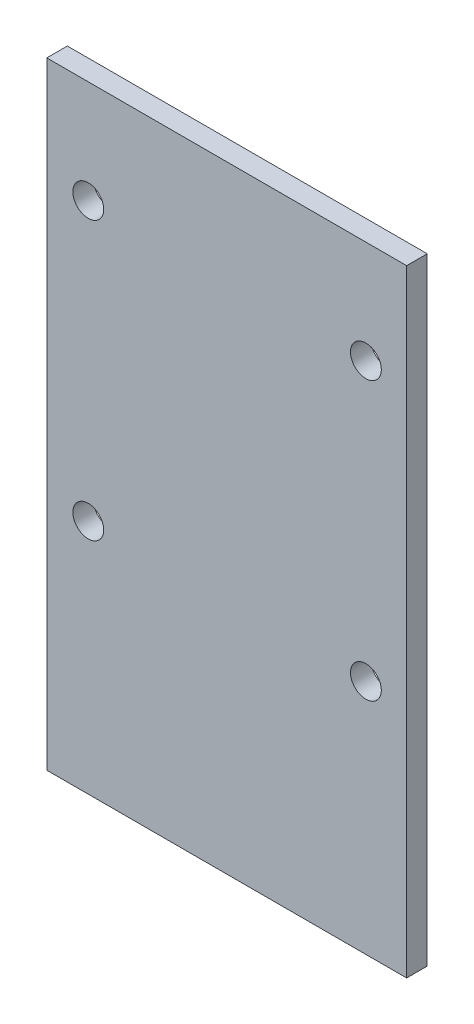
ISO-10303-21;
HEADER;
FILE_DESCRIPTION(('STEP AP214'),'2;1');
FILE_NAME('part.step','',(''),(''),'','','');
FILE_SCHEMA(('AUTOMOTIVE_DESIGN { 1 0 10303 214 1 1 1 1 }'));
ENDSEC;
DATA;
#1=APPLICATION_CONTEXT('core data for automotive mechanical design processes');
#2=APPLICATION_PROTOCOL_DEFINITION('international standard','automotive_design',2000,#1);
#3=PRODUCT_CONTEXT('',#1,'mechanical');
#4=PRODUCT('Part','Part','',(#3));
#5=PRODUCT_RELATED_PRODUCT_CATEGORY('part','',(#4));
#6=PRODUCT_DEFINITION_FORMATION('','',#4);
#7=PRODUCT_DEFINITION_CONTEXT('part definition',#1,'design');
#8=PRODUCT_DEFINITION('design','',#6,#7);
#9=PRODUCT_DEFINITION_SHAPE('','',#8);
#10=(LENGTH_UNIT() NAMED_UNIT(*) SI_UNIT(.MILLI.,.METRE.));
#11=(NAMED_UNIT(*) PLANE_ANGLE_UNIT() SI_UNIT($,.RADIAN.));
#12=(NAMED_UNIT(*) SI_UNIT($,.STERADIAN.) SOLID_ANGLE_UNIT());
#13=UNCERTAINTY_MEASURE_WITH_UNIT(LENGTH_MEASURE(1.E-05),#10,'distance_accuracy_value','');
#14=(GEOMETRIC_REPRESENTATION_CONTEXT(3) GLOBAL_UNCERTAINTY_ASSIGNED_CONTEXT((#13)) GLOBAL_UNIT_ASSIGNED_CONTEXT((#10,
#11,#12)) REPRESENTATION_CONTEXT('',''));
#15=CARTESIAN_POINT('',(0.,0.,0.));
#16=DIRECTION('',(0.,0.,1.));
#17=DIRECTION('',(1.,0.,0.));
#18=AXIS2_PLACEMENT_3D('',#15,#16,#17);
#19=CARTESIAN_POINT('',(-17.5,-30.,2.));
#20=DIRECTION('',(1.,0.,0.));
#21=DIRECTION('',(0.,0.,-1.));
#22=AXIS2_PLACEMENT_3D('',#19,#20,#21);
#23=PLANE('',#22);
#24=DIRECTION('',(0.,-1.,0.));
#25=VECTOR('',#24,1.);
#26=CARTESIAN_POINT('',(-17.5,-30.,0.));
#27=LINE('',#26,#25);
#28=CARTESIAN_POINT('',(-17.5,30.,0.));
#29=VERTEX_POINT('',#28);
#30=CARTESIAN_POINT('',(-17.5,-30.,0.));
#31=VERTEX_POINT('',#30);
#32=EDGE_CURVE('E107',#29,#31,#27,.T.);
#33=ORIENTED_EDGE('',*,*,#32,.T.);
#34=DIRECTION('',(0.,0.,-1.));
#35=VECTOR('',#34,1.);
#36=CARTESIAN_POINT('',(-17.5,-30.,2.));
#37=LINE('',#36,#35);
#38=CARTESIAN_POINT('',(-17.5,-30.,2.));
#39=VERTEX_POINT('',#38);
#40=EDGE_CURVE('E11',#39,#31,#37,.T.);
#41=ORIENTED_EDGE('',*,*,#40,.F.);
#42=DIRECTION('',(0.,-1.,0.));
#43=VECTOR('',#42,1.);
#44=CARTESIAN_POINT('',(-17.5,-30.,2.));
#45=LINE('',#44,#43);
#46=CARTESIAN_POINT('',(-17.5,30.,2.));
#47=VERTEX_POINT('',#46);
#48=EDGE_CURVE('E91',#47,#39,#45,.T.);
#49=ORIENTED_EDGE('',*,*,#48,.F.);
#50=DIRECTION('',(0.,0.,-1.));
#51=VECTOR('',#50,1.);
#52=CARTESIAN_POINT('',(-17.5,30.,2.));
#53=LINE('',#52,#51);
#54=EDGE_CURVE('E103',#47,#29,#53,.T.);
#55=ORIENTED_EDGE('',*,*,#54,.T.);
#56=EDGE_LOOP('',(#33,#41,#49,#55));
#57=FACE_BOUND('',#56,.T.);
#58=ADVANCED_FACE('F39',(#57),#23,.F.);
#59=CARTESIAN_POINT('',(17.5,-30.,2.));
#60=DIRECTION('',(0.,1.,0.));
#61=DIRECTION('',(-1.,0.,0.));
#62=AXIS2_PLACEMENT_3D('',#59,#60,#61);
#63=PLANE('',#62);
#64=DIRECTION('',(1.,0.,0.));
#65=VECTOR('',#64,1.);
#66=CARTESIAN_POINT('',(17.5,-30.,0.));
#67=LINE('',#66,#65);
#68=CARTESIAN_POINT('',(17.5,-30.,0.));
#69=VERTEX_POINT('',#68);
#70=EDGE_CURVE('E96',#31,#69,#67,.T.);
#71=ORIENTED_EDGE('',*,*,#70,.T.);
#72=DIRECTION('',(0.,0.,-1.));
#73=VECTOR('',#72,1.);
#74=CARTESIAN_POINT('',(17.5,-30.,2.));
#75=LINE('',#74,#73);
#76=CARTESIAN_POINT('',(17.5,-30.,2.));
#77=VERTEX_POINT('',#76);
#78=EDGE_CURVE('E48',#77,#69,#75,.T.);
#79=ORIENTED_EDGE('',*,*,#78,.F.);
#80=DIRECTION('',(1.,0.,0.));
#81=VECTOR('',#80,1.);
#82=CARTESIAN_POINT('',(17.5,-30.,2.));
#83=LINE('',#82,#81);
#84=EDGE_CURVE('E86',#39,#77,#83,.T.);
#85=ORIENTED_EDGE('',*,*,#84,.F.);
#86=ORIENTED_EDGE('',*,*,#40,.T.);
#87=EDGE_LOOP('',(#71,#79,#85,#86));
#88=FACE_BOUND('',#87,.T.);
#89=ADVANCED_FACE('F95',(#88),#63,.F.);
#90=CARTESIAN_POINT('',(17.5,-30.,2.));
#91=DIRECTION('',(-1.,0.,0.));
#92=DIRECTION('',(0.,0.,1.));
#93=AXIS2_PLACEMENT_3D('',#90,#91,#92);
#94=PLANE('',#93);
#95=DIRECTION('',(0.,1.,0.));
#96=VECTOR('',#95,1.);
#97=CARTESIAN_POINT('',(17.5,-30.,0.));
#98=LINE('',#97,#96);
#99=CARTESIAN_POINT('',(17.5,30.,0.));
#100=VERTEX_POINT('',#99);
#101=EDGE_CURVE('E73',#69,#100,#98,.T.);
#102=ORIENTED_EDGE('',*,*,#101,.T.);
#103=DIRECTION('',(0.,0.,-1.));
#104=VECTOR('',#103,1.);
#105=CARTESIAN_POINT('',(17.5,30.,2.));
#106=LINE('',#105,#104);
#107=CARTESIAN_POINT('',(17.5,30.,2.));
#108=VERTEX_POINT('',#107);
#109=EDGE_CURVE('E98',#108,#100,#106,.T.);
#110=ORIENTED_EDGE('',*,*,#109,.F.);
#111=DIRECTION('',(0.,1.,0.));
#112=VECTOR('',#111,1.);
#113=CARTESIAN_POINT('',(17.5,-30.,2.));
#114=LINE('',#113,#112);
#115=EDGE_CURVE('E89',#77,#108,#114,.T.);
#116=ORIENTED_EDGE('',*,*,#115,.F.);
#117=ORIENTED_EDGE('',*,*,#78,.T.);
#118=EDGE_LOOP('',(#102,#110,#116,#117));
#119=FACE_BOUND('',#118,.T.);
#120=ADVANCED_FACE('F99',(#119),#94,.F.);
#121=CARTESIAN_POINT('',(17.5,30.,2.));
#122=DIRECTION('',(0.,-1.,0.));
#123=DIRECTION('',(1.,0.,0.));
#124=AXIS2_PLACEMENT_3D('',#121,#122,#123);
#125=PLANE('',#124);
#126=DIRECTION('',(-1.,0.,0.));
#127=VECTOR('',#126,1.);
#128=CARTESIAN_POINT('',(17.5,30.,0.));
#129=LINE('',#128,#127);
#130=EDGE_CURVE('E79',#100,#29,#129,.T.);
#131=ORIENTED_EDGE('',*,*,#130,.T.);
#132=ORIENTED_EDGE('',*,*,#54,.F.);
#133=DIRECTION('',(-1.,0.,0.));
#134=VECTOR('',#133,1.);
#135=CARTESIAN_POINT('',(17.5,30.,2.));
#136=LINE('',#135,#134);
#137=EDGE_CURVE('E56',#108,#47,#136,.T.);
#138=ORIENTED_EDGE('',*,*,#137,.F.);
#139=ORIENTED_EDGE('',*,*,#109,.T.);
#140=EDGE_LOOP('',(#131,#132,#138,#139));
#141=FACE_BOUND('',#140,.T.);
#142=ADVANCED_FACE('F121',(#141),#125,.F.);
#143=CARTESIAN_POINT('',(0.,0.,2.));
#144=DIRECTION('',(0.,0.,1.));
#145=DIRECTION('',(1.,0.,0.));
#146=AXIS2_PLACEMENT_3D('',#143,#144,#145);
#147=PLANE('',#146);
#148=CARTESIAN_POINT('',(13.5357047155097,20.,2.));
#149=DIRECTION('',(0.,0.,1.));
#150=DIRECTION('',(1.,0.,0.));
#151=AXIS2_PLACEMENT_3D('',#148,#149,#150);
#152=CIRCLE('',#151,1.5);
#153=CARTESIAN_POINT('',(15.0357047155097,20.,2.));
#154=VERTEX_POINT('',#153);
#155=EDGE_CURVE('E145',#154,#154,#152,.T.);
#156=ORIENTED_EDGE('',*,*,#155,.F.);
#157=EDGE_LOOP('',(#156));
#158=FACE_BOUND('',#157,.T.);
#159=CARTESIAN_POINT('',(-13.4642952844903,-6.99999999999999,2.));
#160=DIRECTION('',(0.,0.,1.));
#161=DIRECTION('',(1.,0.,0.));
#162=AXIS2_PLACEMENT_3D('',#159,#160,#161);
#163=CIRCLE('',#162,1.5);
#164=CARTESIAN_POINT('',(-11.9642952844903,-6.99999999999999,2.));
#165=VERTEX_POINT('',#164);
#166=EDGE_CURVE('E136',#165,#165,#163,.T.);
#167=ORIENTED_EDGE('',*,*,#166,.F.);
#168=EDGE_LOOP('',(#167));
#169=FACE_BOUND('',#168,.T.);
#170=CARTESIAN_POINT('',(13.5357047155097,-6.99999999999998,2.));
#171=DIRECTION('',(0.,0.,1.));
#172=DIRECTION('',(1.,0.,0.));
#173=AXIS2_PLACEMENT_3D('',#170,#171,#172);
#174=CIRCLE('',#173,1.5);
#175=CARTESIAN_POINT('',(15.0357047155097,-6.99999999999998,2.));
#176=VERTEX_POINT('',#175);
#177=EDGE_CURVE('E152',#176,#176,#174,.T.);
#178=ORIENTED_EDGE('',*,*,#177,.F.);
#179=EDGE_LOOP('',(#178));
#180=FACE_BOUND('',#179,.T.);
#181=CARTESIAN_POINT('',(-13.4642952844903,20.,2.));
#182=DIRECTION('',(0.,0.,1.));
#183=DIRECTION('',(1.,0.,0.));
#184=AXIS2_PLACEMENT_3D('',#181,#182,#183);
#185=CIRCLE('',#184,1.5);
#186=CARTESIAN_POINT('',(-11.9642952844903,20.,2.));
#187=VERTEX_POINT('',#186);
#188=EDGE_CURVE('E128',#187,#187,#185,.T.);
#189=ORIENTED_EDGE('',*,*,#188,.F.);
#190=EDGE_LOOP('',(#189));
#191=FACE_BOUND('',#190,.T.);
#192=ORIENTED_EDGE('',*,*,#48,.T.);
#193=ORIENTED_EDGE('',*,*,#84,.T.);
#194=ORIENTED_EDGE('',*,*,#115,.T.);
#195=ORIENTED_EDGE('',*,*,#137,.T.);
#196=EDGE_LOOP('',(#192,#193,#194,#195));
#197=FACE_BOUND('',#196,.T.);
#198=ADVANCED_FACE('F87',(#158,#169,#180,#191,#197),#147,.T.);
#199=CARTESIAN_POINT('',(0.,0.,0.));
#200=DIRECTION('',(0.,0.,1.));
#201=DIRECTION('',(1.,0.,0.));
#202=AXIS2_PLACEMENT_3D('',#199,#200,#201);
#203=PLANE('',#202);
#204=CARTESIAN_POINT('',(13.5357047155097,20.,0.));
#205=DIRECTION('',(0.,0.,1.));
#206=DIRECTION('',(1.,0.,0.));
#207=AXIS2_PLACEMENT_3D('',#204,#205,#206);
#208=CIRCLE('',#207,1.5);
#209=CARTESIAN_POINT('',(15.0357047155097,20.,0.));
#210=VERTEX_POINT('',#209);
#211=EDGE_CURVE('E132',#210,#210,#208,.T.);
#212=ORIENTED_EDGE('',*,*,#211,.T.);
#213=EDGE_LOOP('',(#212));
#214=FACE_BOUND('',#213,.T.);
#215=CARTESIAN_POINT('',(-13.4642952844903,-6.99999999999999,0.));
#216=DIRECTION('',(0.,0.,1.));
#217=DIRECTION('',(1.,0.,0.));
#218=AXIS2_PLACEMENT_3D('',#215,#216,#217);
#219=CIRCLE('',#218,1.5);
#220=CARTESIAN_POINT('',(-11.9642952844903,-6.99999999999999,0.));
#221=VERTEX_POINT('',#220);
#222=EDGE_CURVE('E140',#221,#221,#219,.T.);
#223=ORIENTED_EDGE('',*,*,#222,.T.);
#224=EDGE_LOOP('',(#223));
#225=FACE_BOUND('',#224,.T.);
#226=CARTESIAN_POINT('',(13.5357047155097,-6.99999999999998,0.));
#227=DIRECTION('',(0.,0.,1.));
#228=DIRECTION('',(1.,0.,0.));
#229=AXIS2_PLACEMENT_3D('',#226,#227,#228);
#230=CIRCLE('',#229,1.5);
#231=CARTESIAN_POINT('',(15.0357047155097,-6.99999999999998,0.));
#232=VERTEX_POINT('',#231);
#233=EDGE_CURVE('E141',#232,#232,#230,.T.);
#234=ORIENTED_EDGE('',*,*,#233,.T.);
#235=EDGE_LOOP('',(#234));
#236=FACE_BOUND('',#235,.T.);
#237=CARTESIAN_POINT('',(-13.4642952844903,20.,0.));
#238=DIRECTION('',(0.,0.,1.));
#239=DIRECTION('',(1.,0.,0.));
#240=AXIS2_PLACEMENT_3D('',#237,#238,#239);
#241=CIRCLE('',#240,1.5);
#242=CARTESIAN_POINT('',(-11.9642952844903,20.,0.));
#243=VERTEX_POINT('',#242);
#244=EDGE_CURVE('E111',#243,#243,#241,.T.);
#245=ORIENTED_EDGE('',*,*,#244,.T.);
#246=EDGE_LOOP('',(#245));
#247=FACE_BOUND('',#246,.T.);
#248=ORIENTED_EDGE('',*,*,#32,.F.);
#249=ORIENTED_EDGE('',*,*,#130,.F.);
#250=ORIENTED_EDGE('',*,*,#101,.F.);
#251=ORIENTED_EDGE('',*,*,#70,.F.);
#252=EDGE_LOOP('',(#248,#249,#250,#251));
#253=FACE_BOUND('',#252,.T.);
#254=ADVANCED_FACE('F124',(#214,#225,#236,#247,#253),#203,.F.);
#255=CARTESIAN_POINT('',(-13.4642952844903,20.,0.));
#256=DIRECTION('',(0.,0.,1.));
#257=DIRECTION('',(1.,0.,0.));
#258=AXIS2_PLACEMENT_3D('',#255,#256,#257);
#259=CYLINDRICAL_SURFACE('',#258,1.5);
#260=ORIENTED_EDGE('',*,*,#244,.F.);
#261=EDGE_LOOP('',(#260));
#262=FACE_BOUND('',#261,.T.);
#263=ORIENTED_EDGE('',*,*,#188,.T.);
#264=EDGE_LOOP('',(#263));
#265=FACE_BOUND('',#264,.T.);
#266=ADVANCED_FACE('F166',(#262,#265),#259,.F.);
#267=CARTESIAN_POINT('',(13.5357047155097,-6.99999999999998,0.));
#268=DIRECTION('',(0.,0.,1.));
#269=DIRECTION('',(1.,0.,0.));
#270=AXIS2_PLACEMENT_3D('',#267,#268,#269);
#271=CYLINDRICAL_SURFACE('',#270,1.5);
#272=ORIENTED_EDGE('',*,*,#233,.F.);
#273=EDGE_LOOP('',(#272));
#274=FACE_BOUND('',#273,.T.);
#275=ORIENTED_EDGE('',*,*,#177,.T.);
#276=EDGE_LOOP('',(#275));
#277=FACE_BOUND('',#276,.T.);
#278=ADVANCED_FACE('F162',(#274,#277),#271,.F.);
#279=CARTESIAN_POINT('',(-13.4642952844903,-6.99999999999999,0.));
#280=DIRECTION('',(0.,0.,1.));
#281=DIRECTION('',(1.,0.,0.));
#282=AXIS2_PLACEMENT_3D('',#279,#280,#281);
#283=CYLINDRICAL_SURFACE('',#282,1.5);
#284=ORIENTED_EDGE('',*,*,#222,.F.);
#285=EDGE_LOOP('',(#284));
#286=FACE_BOUND('',#285,.T.);
#287=ORIENTED_EDGE('',*,*,#166,.T.);
#288=EDGE_LOOP('',(#287));
#289=FACE_BOUND('',#288,.T.);
#290=ADVANCED_FACE('F165',(#286,#289),#283,.F.);
#291=CARTESIAN_POINT('',(13.5357047155097,20.,0.));
#292=DIRECTION('',(0.,0.,1.));
#293=DIRECTION('',(1.,0.,0.));
#294=AXIS2_PLACEMENT_3D('',#291,#292,#293);
#295=CYLINDRICAL_SURFACE('',#294,1.5);
#296=ORIENTED_EDGE('',*,*,#211,.F.);
#297=EDGE_LOOP('',(#296));
#298=FACE_BOUND('',#297,.T.);
#299=ORIENTED_EDGE('',*,*,#155,.T.);
#300=EDGE_LOOP('',(#299));
#301=FACE_BOUND('',#300,.T.);
#302=ADVANCED_FACE('F227',(#298,#301),#295,.F.);
#303=CLOSED_SHELL('',(#58,#89,#120,#142,#198,#254,#266,#278,#290,#302));
#304=MANIFOLD_SOLID_BREP('B2',#303);
#305=ADVANCED_BREP_SHAPE_REPRESENTATION('',(#18,#304),#14);
#306=SHAPE_DEFINITION_REPRESENTATION(#9,#305);
ENDSEC;
END-ISO-10303-21;
